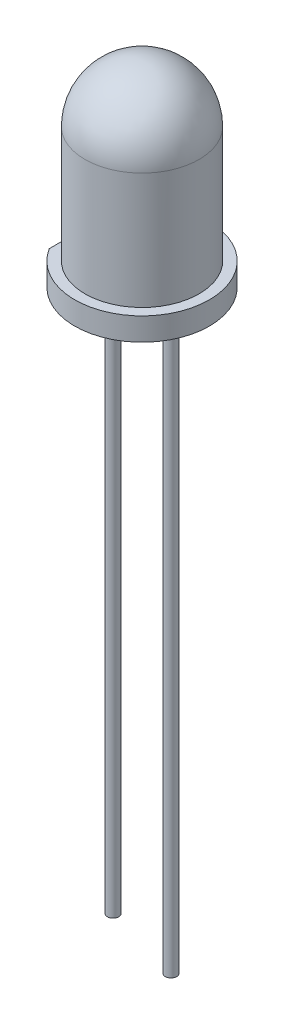
ISO-10303-21;
HEADER;
FILE_DESCRIPTION(('STEP AP214'),'2;1');
FILE_NAME('part.step','',(''),(''),'','','');
FILE_SCHEMA(('AUTOMOTIVE_DESIGN { 1 0 10303 214 1 1 1 1 }'));
ENDSEC;
DATA;
#1=APPLICATION_CONTEXT('core data for automotive mechanical design processes');
#2=APPLICATION_PROTOCOL_DEFINITION('international standard','automotive_design',2000,#1);
#3=PRODUCT_CONTEXT('',#1,'mechanical');
#4=PRODUCT('Part','Part','',(#3));
#5=PRODUCT_RELATED_PRODUCT_CATEGORY('part','',(#4));
#6=PRODUCT_DEFINITION_FORMATION('','',#4);
#7=PRODUCT_DEFINITION_CONTEXT('part definition',#1,'design');
#8=PRODUCT_DEFINITION('design','',#6,#7);
#9=PRODUCT_DEFINITION_SHAPE('','',#8);
#10=(LENGTH_UNIT() NAMED_UNIT(*) SI_UNIT(.MILLI.,.METRE.));
#11=(NAMED_UNIT(*) PLANE_ANGLE_UNIT() SI_UNIT($,.RADIAN.));
#12=(NAMED_UNIT(*) SI_UNIT($,.STERADIAN.) SOLID_ANGLE_UNIT());
#13=UNCERTAINTY_MEASURE_WITH_UNIT(LENGTH_MEASURE(1.E-05),#10,'distance_accuracy_value','');
#14=(GEOMETRIC_REPRESENTATION_CONTEXT(3) GLOBAL_UNCERTAINTY_ASSIGNED_CONTEXT((#13)) GLOBAL_UNIT_ASSIGNED_CONTEXT((#10,
#11,#12)) REPRESENTATION_CONTEXT('',''));
#15=CARTESIAN_POINT('',(0.,0.,0.));
#16=DIRECTION('',(0.,0.,1.));
#17=DIRECTION('',(1.,0.,0.));
#18=AXIS2_PLACEMENT_3D('',#15,#16,#17);
#19=CARTESIAN_POINT('',(2.95,-2.55,0.));
#20=DIRECTION('',(0.,1.,0.));
#21=DIRECTION('',(1.,0.,0.));
#22=AXIS2_PLACEMENT_3D('',#19,#20,#21);
#23=PLANE('',#22);
#24=DIRECTION('',(0.,0.,1.));
#25=VECTOR('',#24,1.);
#26=CARTESIAN_POINT('',(-2.5,-2.55,0.));
#27=LINE('',#26,#25);
#28=CARTESIAN_POINT('',(-2.5,-2.55,0.));
#29=VERTEX_POINT('',#28);
#30=CARTESIAN_POINT('',(-2.5,-2.55,1.56604597633658));
#31=VERTEX_POINT('',#30);
#32=EDGE_CURVE('E130',#29,#31,#27,.T.);
#33=ORIENTED_EDGE('',*,*,#32,.T.);
#34=CARTESIAN_POINT('',(0.,-2.55,0.));
#35=DIRECTION('',(0.,-1.,0.));
#36=DIRECTION('',(1.,0.,0.));
#37=AXIS2_PLACEMENT_3D('',#34,#35,#36);
#38=CIRCLE('',#37,2.95);
#39=CARTESIAN_POINT('',(-2.5,-2.55,-1.56604597633658));
#40=VERTEX_POINT('',#39);
#41=EDGE_CURVE('E115',#40,#31,#38,.T.);
#42=ORIENTED_EDGE('',*,*,#41,.F.);
#43=DIRECTION('',(0.,0.,1.));
#44=VECTOR('',#43,1.);
#45=CARTESIAN_POINT('',(-2.5,-2.55,0.));
#46=LINE('',#45,#44);
#47=EDGE_CURVE('E133',#40,#29,#46,.T.);
#48=ORIENTED_EDGE('',*,*,#47,.T.);
#49=CARTESIAN_POINT('',(0.,-2.55,0.));
#50=DIRECTION('',(0.,-1.,0.));
#51=DIRECTION('',(1.,0.,0.));
#52=AXIS2_PLACEMENT_3D('',#49,#50,#51);
#53=CIRCLE('',#52,2.5);
#54=EDGE_CURVE('E26',#29,#29,#53,.T.);
#55=ORIENTED_EDGE('',*,*,#54,.T.);
#56=EDGE_LOOP('',(#33,#42,#48,#55));
#57=FACE_BOUND('',#56,.T.);
#58=ADVANCED_FACE('F15',(#57),#23,.T.);
#59=CARTESIAN_POINT('',(0.,0.,0.));
#60=DIRECTION('',(0.,-1.,0.));
#61=DIRECTION('',(1.,0.,0.));
#62=AXIS2_PLACEMENT_3D('',#59,#60,#61);
#63=CYLINDRICAL_SURFACE('',#62,2.5);
#64=ORIENTED_EDGE('',*,*,#54,.F.);
#65=DIRECTION('',(0.,1.,0.));
#66=VECTOR('',#65,1.);
#67=CARTESIAN_POINT('',(-2.5,0.,0.));
#68=LINE('',#67,#66);
#69=CARTESIAN_POINT('',(-2.5,2.55,0.));
#70=VERTEX_POINT('',#69);
#71=EDGE_CURVE('E9',#29,#70,#68,.T.);
#72=ORIENTED_EDGE('',*,*,#71,.T.);
#73=CARTESIAN_POINT('',(0.,2.55,0.));
#74=DIRECTION('',(0.,-1.,0.));
#75=DIRECTION('',(1.,0.,0.));
#76=AXIS2_PLACEMENT_3D('',#73,#74,#75);
#77=CIRCLE('',#76,2.5);
#78=CARTESIAN_POINT('',(0.,2.55,2.5));
#79=VERTEX_POINT('',#78);
#80=EDGE_CURVE('E175',#70,#79,#77,.T.);
#81=ORIENTED_EDGE('',*,*,#80,.T.);
#82=CARTESIAN_POINT('',(0.,2.55,0.));
#83=DIRECTION('',(0.,-1.,0.));
#84=DIRECTION('',(1.,0.,0.));
#85=AXIS2_PLACEMENT_3D('',#82,#83,#84);
#86=CIRCLE('',#85,2.5);
#87=EDGE_CURVE('E152',#79,#70,#86,.T.);
#88=ORIENTED_EDGE('',*,*,#87,.T.);
#89=ORIENTED_EDGE('',*,*,#71,.F.);
#90=EDGE_LOOP('',(#64,#72,#81,#88,#89));
#91=FACE_BOUND('',#90,.T.);
#92=ADVANCED_FACE('F234',(#91),#63,.T.);
#93=CARTESIAN_POINT('',(0.,2.55,0.));
#94=DIRECTION('',(0.,1.,0.));
#95=DIRECTION('',(0.,0.,-1.));
#96=AXIS2_PLACEMENT_3D('',#93,#94,#95);
#97=SPHERICAL_SURFACE('',#96,2.5);
#98=ORIENTED_EDGE('',*,*,#80,.F.);
#99=ORIENTED_EDGE('',*,*,#87,.F.);
#100=CARTESIAN_POINT('',(0.,2.55,0.));
#101=DIRECTION('',(1.,0.,0.));
#102=DIRECTION('',(0.,0.,1.));
#103=AXIS2_PLACEMENT_3D('',#100,#101,#102);
#104=CIRCLE('',#103,2.5);
#105=CARTESIAN_POINT('',(0.,5.05,0.));
#106=VERTEX_POINT('',#105);
#107=EDGE_CURVE('E39',#106,#79,#104,.T.);
#108=ORIENTED_EDGE('',*,*,#107,.F.);
#109=ORIENTED_EDGE('',*,*,#107,.T.);
#110=EDGE_LOOP('',(#98,#99,#108,#109));
#111=FACE_BOUND('',#110,.T.);
#112=ADVANCED_FACE('F239',(#111),#97,.T.);
#113=CARTESIAN_POINT('',(1.27,-28.95,0.));
#114=DIRECTION('',(0.,-1.,0.));
#115=DIRECTION('',(0.,0.,-1.));
#116=AXIS2_PLACEMENT_3D('',#113,#114,#115);
#117=PLANE('',#116);
#118=CARTESIAN_POINT('',(1.27,-28.95,0.));
#119=DIRECTION('',(0.,-1.,0.));
#120=DIRECTION('',(1.,0.,0.));
#121=AXIS2_PLACEMENT_3D('',#118,#119,#120);
#122=CIRCLE('',#121,0.25);
#123=CARTESIAN_POINT('',(1.02,-28.95,0.));
#124=VERTEX_POINT('',#123);
#125=EDGE_CURVE('E158',#124,#124,#122,.T.);
#126=ORIENTED_EDGE('',*,*,#125,.T.);
#127=EDGE_LOOP('',(#126));
#128=FACE_BOUND('',#127,.T.);
#129=ADVANCED_FACE('F229',(#128),#117,.T.);
#130=CARTESIAN_POINT('',(-1.27,-27.95,0.));
#131=DIRECTION('',(0.,-1.,0.));
#132=DIRECTION('',(0.,0.,-1.));
#133=AXIS2_PLACEMENT_3D('',#130,#131,#132);
#134=PLANE('',#133);
#135=CARTESIAN_POINT('',(-1.27,-27.95,0.));
#136=DIRECTION('',(0.,1.,0.));
#137=DIRECTION('',(1.,0.,0.));
#138=AXIS2_PLACEMENT_3D('',#135,#136,#137);
#139=CIRCLE('',#138,0.25);
#140=CARTESIAN_POINT('',(-1.52,-27.95,0.));
#141=VERTEX_POINT('',#140);
#142=EDGE_CURVE('E19',#141,#141,#139,.T.);
#143=ORIENTED_EDGE('',*,*,#142,.F.);
#144=EDGE_LOOP('',(#143));
#145=FACE_BOUND('',#144,.T.);
#146=ADVANCED_FACE('F220',(#145),#134,.T.);
#147=CARTESIAN_POINT('',(-1.27,-28.95,0.));
#148=DIRECTION('',(0.,1.,0.));
#149=DIRECTION('',(1.,0.,0.));
#150=AXIS2_PLACEMENT_3D('',#147,#148,#149);
#151=CYLINDRICAL_SURFACE('',#150,0.25);
#152=CARTESIAN_POINT('',(-1.27,-3.75,0.));
#153=DIRECTION('',(0.,1.,0.));
#154=DIRECTION('',(1.,0.,0.));
#155=AXIS2_PLACEMENT_3D('',#152,#153,#154);
#156=CIRCLE('',#155,0.25);
#157=CARTESIAN_POINT('',(-1.52,-3.75,0.));
#158=VERTEX_POINT('',#157);
#159=EDGE_CURVE('E188',#158,#158,#156,.T.);
#160=ORIENTED_EDGE('',*,*,#159,.F.);
#161=DIRECTION('',(0.,-1.,0.));
#162=VECTOR('',#161,1.);
#163=CARTESIAN_POINT('',(-1.52,-28.95,0.));
#164=LINE('',#163,#162);
#165=EDGE_CURVE('E185',#158,#141,#164,.T.);
#166=ORIENTED_EDGE('',*,*,#165,.T.);
#167=ORIENTED_EDGE('',*,*,#142,.T.);
#168=ORIENTED_EDGE('',*,*,#165,.F.);
#169=EDGE_LOOP('',(#160,#166,#167,#168));
#170=FACE_BOUND('',#169,.T.);
#171=ADVANCED_FACE('F218',(#170),#151,.T.);
#172=CARTESIAN_POINT('',(-1.27,-3.65,0.));
#173=DIRECTION('',(0.,1.,0.));
#174=DIRECTION('',(1.,0.,0.));
#175=AXIS2_PLACEMENT_3D('',#172,#173,#174);
#176=CONICAL_SURFACE('',#175,0.75,1.37340076694502);
#177=CARTESIAN_POINT('',(-1.27,-3.55,0.));
#178=DIRECTION('',(0.,-1.,0.));
#179=DIRECTION('',(1.,0.,0.));
#180=AXIS2_PLACEMENT_3D('',#177,#178,#179);
#181=CIRCLE('',#180,1.25);
#182=CARTESIAN_POINT('',(-2.5,-3.55,0.222710574513202));
#183=VERTEX_POINT('',#182);
#184=CARTESIAN_POINT('',(-2.52,-3.55,0.));
#185=VERTEX_POINT('',#184);
#186=EDGE_CURVE('E164',#183,#185,#181,.T.);
#187=ORIENTED_EDGE('',*,*,#186,.T.);
#188=DIRECTION('',(0.98058067569092,-0.196116135138184,0.));
#189=VECTOR('',#188,1.);
#190=CARTESIAN_POINT('',(-2.02,-3.65,0.));
#191=LINE('',#190,#189);
#192=EDGE_CURVE('E180',#185,#158,#191,.T.);
#193=ORIENTED_EDGE('',*,*,#192,.T.);
#194=ORIENTED_EDGE('',*,*,#159,.T.);
#195=ORIENTED_EDGE('',*,*,#192,.F.);
#196=CARTESIAN_POINT('',(-1.27,-3.55,0.));
#197=DIRECTION('',(0.,-1.,0.));
#198=DIRECTION('',(1.,0.,0.));
#199=AXIS2_PLACEMENT_3D('',#196,#197,#198);
#200=CIRCLE('',#199,1.25);
#201=CARTESIAN_POINT('',(-2.5,-3.55,-0.222710574513202));
#202=VERTEX_POINT('',#201);
#203=EDGE_CURVE('E150',#185,#202,#200,.T.);
#204=ORIENTED_EDGE('',*,*,#203,.T.);
#205=CARTESIAN_POINT('',(-1.27,-3.55,0.));
#206=DIRECTION('',(0.,-1.,0.));
#207=DIRECTION('',(1.,0.,0.));
#208=AXIS2_PLACEMENT_3D('',#205,#206,#207);
#209=CIRCLE('',#208,1.25);
#210=EDGE_CURVE('E64',#202,#183,#209,.T.);
#211=ORIENTED_EDGE('',*,*,#210,.T.);
#212=EDGE_LOOP('',(#187,#193,#194,#195,#204,#211));
#213=FACE_BOUND('',#212,.T.);
#214=ADVANCED_FACE('F216',(#213),#176,.T.);
#215=CARTESIAN_POINT('',(1.27,-28.95,0.));
#216=DIRECTION('',(0.,1.,0.));
#217=DIRECTION('',(1.,0.,0.));
#218=AXIS2_PLACEMENT_3D('',#215,#216,#217);
#219=CYLINDRICAL_SURFACE('',#218,0.25);
#220=CARTESIAN_POINT('',(1.27,-3.75,0.));
#221=DIRECTION('',(0.,1.,0.));
#222=DIRECTION('',(1.,0.,0.));
#223=AXIS2_PLACEMENT_3D('',#220,#221,#222);
#224=CIRCLE('',#223,0.25);
#225=CARTESIAN_POINT('',(1.02,-3.75,0.));
#226=VERTEX_POINT('',#225);
#227=EDGE_CURVE('E159',#226,#226,#224,.T.);
#228=ORIENTED_EDGE('',*,*,#227,.F.);
#229=DIRECTION('',(0.,-1.,0.));
#230=VECTOR('',#229,1.);
#231=CARTESIAN_POINT('',(1.02,-28.95,0.));
#232=LINE('',#231,#230);
#233=EDGE_CURVE('E154',#226,#124,#232,.T.);
#234=ORIENTED_EDGE('',*,*,#233,.T.);
#235=ORIENTED_EDGE('',*,*,#125,.F.);
#236=ORIENTED_EDGE('',*,*,#233,.F.);
#237=EDGE_LOOP('',(#228,#234,#235,#236));
#238=FACE_BOUND('',#237,.T.);
#239=ADVANCED_FACE('F227',(#238),#219,.T.);
#240=CARTESIAN_POINT('',(1.27,-3.65,0.));
#241=DIRECTION('',(0.,1.,0.));
#242=DIRECTION('',(1.,0.,0.));
#243=AXIS2_PLACEMENT_3D('',#240,#241,#242);
#244=CONICAL_SURFACE('',#243,0.75,1.37340076694502);
#245=CARTESIAN_POINT('',(1.27,-3.55,0.));
#246=DIRECTION('',(0.,-1.,0.));
#247=DIRECTION('',(1.,0.,0.));
#248=AXIS2_PLACEMENT_3D('',#245,#246,#247);
#249=CIRCLE('',#248,1.25);
#250=CARTESIAN_POINT('',(0.0200000000000006,-3.55,0.));
#251=VERTEX_POINT('',#250);
#252=EDGE_CURVE('E171',#251,#251,#249,.T.);
#253=ORIENTED_EDGE('',*,*,#252,.T.);
#254=DIRECTION('',(0.98058067569092,-0.196116135138184,0.));
#255=VECTOR('',#254,1.);
#256=CARTESIAN_POINT('',(0.52,-3.65,0.));
#257=LINE('',#256,#255);
#258=EDGE_CURVE('E167',#251,#226,#257,.T.);
#259=ORIENTED_EDGE('',*,*,#258,.T.);
#260=ORIENTED_EDGE('',*,*,#227,.T.);
#261=ORIENTED_EDGE('',*,*,#258,.F.);
#262=EDGE_LOOP('',(#253,#259,#260,#261));
#263=FACE_BOUND('',#262,.T.);
#264=ADVANCED_FACE('F206',(#263),#244,.T.);
#265=CARTESIAN_POINT('',(0.,-3.55,0.));
#266=DIRECTION('',(0.,-1.,0.));
#267=DIRECTION('',(0.,0.,-1.));
#268=AXIS2_PLACEMENT_3D('',#265,#266,#267);
#269=PLANE('',#268);
#270=ORIENTED_EDGE('',*,*,#252,.F.);
#271=EDGE_LOOP('',(#270));
#272=FACE_BOUND('',#271,.T.);
#273=DIRECTION('',(0.,0.,-1.));
#274=VECTOR('',#273,1.);
#275=CARTESIAN_POINT('',(-2.5,-3.55,0.));
#276=LINE('',#275,#274);
#277=CARTESIAN_POINT('',(-2.5,-3.55,1.56604597633659));
#278=VERTEX_POINT('',#277);
#279=EDGE_CURVE('E137',#278,#183,#276,.T.);
#280=ORIENTED_EDGE('',*,*,#279,.T.);
#281=ORIENTED_EDGE('',*,*,#210,.F.);
#282=DIRECTION('',(0.,0.,-1.));
#283=VECTOR('',#282,1.);
#284=CARTESIAN_POINT('',(-2.5,-3.55,0.));
#285=LINE('',#284,#283);
#286=CARTESIAN_POINT('',(-2.5,-3.55,-1.56604597633659));
#287=VERTEX_POINT('',#286);
#288=EDGE_CURVE('E147',#202,#287,#285,.T.);
#289=ORIENTED_EDGE('',*,*,#288,.T.);
#290=CARTESIAN_POINT('',(0.,-3.55,0.));
#291=DIRECTION('',(0.,-1.,0.));
#292=DIRECTION('',(1.,0.,0.));
#293=AXIS2_PLACEMENT_3D('',#290,#291,#292);
#294=CIRCLE('',#293,2.95);
#295=EDGE_CURVE('E126',#287,#278,#294,.T.);
#296=ORIENTED_EDGE('',*,*,#295,.T.);
#297=EDGE_LOOP('',(#280,#281,#289,#296));
#298=FACE_BOUND('',#297,.T.);
#299=ADVANCED_FACE('F208',(#272,#298),#269,.T.);
#300=CARTESIAN_POINT('',(0.,-3.05,0.));
#301=DIRECTION('',(0.,-1.,0.));
#302=DIRECTION('',(1.,0.,0.));
#303=AXIS2_PLACEMENT_3D('',#300,#301,#302);
#304=CYLINDRICAL_SURFACE('',#303,2.95);
#305=DIRECTION('',(0.,-1.,0.));
#306=VECTOR('',#305,1.);
#307=CARTESIAN_POINT('',(-2.5,-3.05,1.56604597633658));
#308=LINE('',#307,#306);
#309=EDGE_CURVE('E119',#31,#278,#308,.T.);
#310=ORIENTED_EDGE('',*,*,#309,.T.);
#311=ORIENTED_EDGE('',*,*,#295,.F.);
#312=DIRECTION('',(0.,1.,0.));
#313=VECTOR('',#312,1.);
#314=CARTESIAN_POINT('',(-2.5,-3.05,-1.56604597633658));
#315=LINE('',#314,#313);
#316=EDGE_CURVE('E121',#287,#40,#315,.T.);
#317=ORIENTED_EDGE('',*,*,#316,.T.);
#318=ORIENTED_EDGE('',*,*,#41,.T.);
#319=EDGE_LOOP('',(#310,#311,#317,#318));
#320=FACE_BOUND('',#319,.T.);
#321=ADVANCED_FACE('F117',(#320),#304,.T.);
#322=CARTESIAN_POINT('',(-2.95,-3.55,0.));
#323=DIRECTION('',(0.,-1.,0.));
#324=DIRECTION('',(0.,0.,-1.));
#325=AXIS2_PLACEMENT_3D('',#322,#323,#324);
#326=PLANE('',#325);
#327=ORIENTED_EDGE('',*,*,#186,.F.);
#328=DIRECTION('',(0.,0.,1.));
#329=VECTOR('',#328,1.);
#330=CARTESIAN_POINT('',(-2.5,-3.55,0.));
#331=LINE('',#330,#329);
#332=EDGE_CURVE('E145',#202,#183,#331,.T.);
#333=ORIENTED_EDGE('',*,*,#332,.F.);
#334=ORIENTED_EDGE('',*,*,#203,.F.);
#335=EDGE_LOOP('',(#327,#333,#334));
#336=FACE_BOUND('',#335,.T.);
#337=ADVANCED_FACE('F215',(#336),#326,.F.);
#338=CARTESIAN_POINT('',(-2.5,-3.55,0.));
#339=DIRECTION('',(1.,0.,0.));
#340=DIRECTION('',(0.,1.,0.));
#341=AXIS2_PLACEMENT_3D('',#338,#339,#340);
#342=PLANE('',#341);
#343=ORIENTED_EDGE('',*,*,#309,.F.);
#344=ORIENTED_EDGE('',*,*,#32,.F.);
#345=ORIENTED_EDGE('',*,*,#47,.F.);
#346=ORIENTED_EDGE('',*,*,#316,.F.);
#347=ORIENTED_EDGE('',*,*,#288,.F.);
#348=ORIENTED_EDGE('',*,*,#332,.T.);
#349=ORIENTED_EDGE('',*,*,#279,.F.);
#350=EDGE_LOOP('',(#343,#344,#345,#346,#347,#348,#349));
#351=FACE_BOUND('',#350,.T.);
#352=ADVANCED_FACE('F17',(#351),#342,.F.);
#353=CLOSED_SHELL('',(#58,#92,#112,#129,#146,#171,#214,#239,#264,#299,#321,#337,#352));
#354=MANIFOLD_SOLID_BREP('B1',#353);
#355=ADVANCED_BREP_SHAPE_REPRESENTATION('',(#18,#354),#14);
#356=SHAPE_DEFINITION_REPRESENTATION(#9,#355);
ENDSEC;
END-ISO-10303-21;
